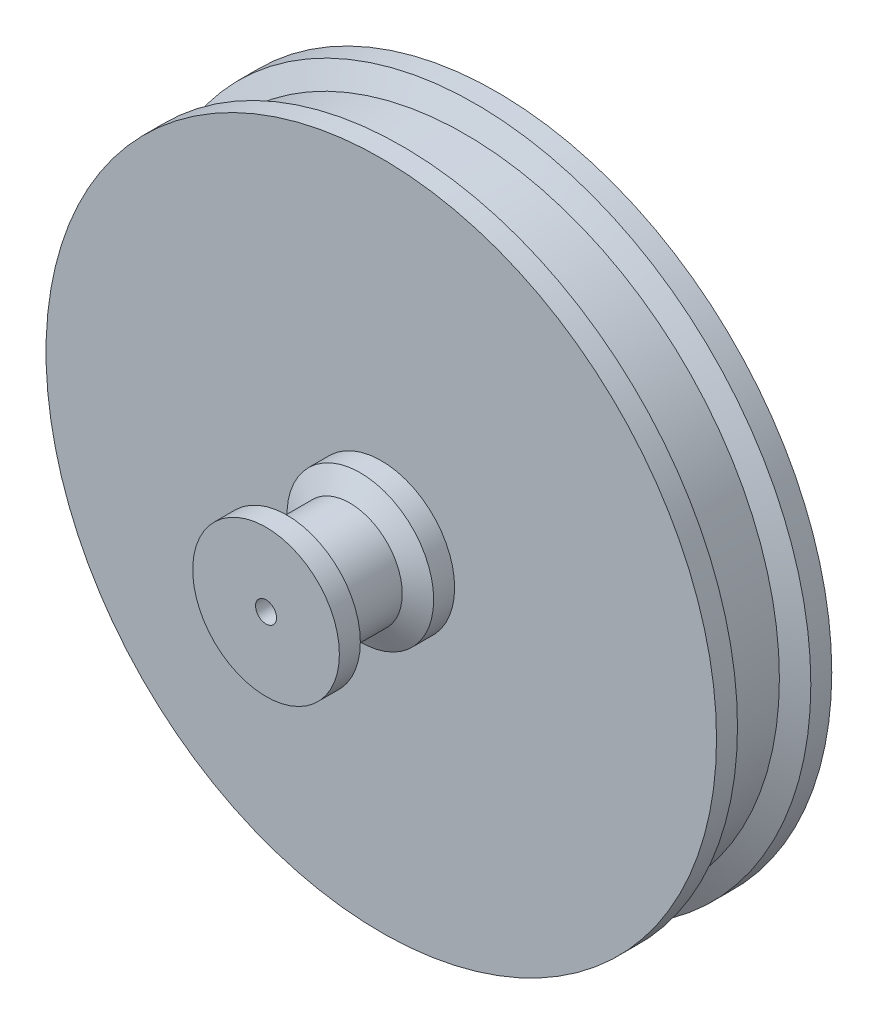
ISO-10303-21;
HEADER;
FILE_DESCRIPTION(('STEP AP214'),'2;1');
FILE_NAME('part.step','',(''),(''),'','','');
FILE_SCHEMA(('AUTOMOTIVE_DESIGN { 1 0 10303 214 1 1 1 1 }'));
ENDSEC;
DATA;
#1=APPLICATION_CONTEXT('core data for automotive mechanical design processes');
#2=APPLICATION_PROTOCOL_DEFINITION('international standard','automotive_design',2000,#1);
#3=PRODUCT_CONTEXT('',#1,'mechanical');
#4=PRODUCT('Part','Part','',(#3));
#5=PRODUCT_RELATED_PRODUCT_CATEGORY('part','',(#4));
#6=PRODUCT_DEFINITION_FORMATION('','',#4);
#7=PRODUCT_DEFINITION_CONTEXT('part definition',#1,'design');
#8=PRODUCT_DEFINITION('design','',#6,#7);
#9=PRODUCT_DEFINITION_SHAPE('','',#8);
#10=(LENGTH_UNIT() NAMED_UNIT(*) SI_UNIT(.MILLI.,.METRE.));
#11=(NAMED_UNIT(*) PLANE_ANGLE_UNIT() SI_UNIT($,.RADIAN.));
#12=(NAMED_UNIT(*) SI_UNIT($,.STERADIAN.) SOLID_ANGLE_UNIT());
#13=UNCERTAINTY_MEASURE_WITH_UNIT(LENGTH_MEASURE(1.E-05),#10,'distance_accuracy_value','');
#14=(GEOMETRIC_REPRESENTATION_CONTEXT(3) GLOBAL_UNCERTAINTY_ASSIGNED_CONTEXT((#13)) GLOBAL_UNIT_ASSIGNED_CONTEXT((#10,
#11,#12)) REPRESENTATION_CONTEXT('',''));
#15=CARTESIAN_POINT('',(0.,0.,0.));
#16=DIRECTION('',(0.,0.,1.));
#17=DIRECTION('',(1.,0.,0.));
#18=AXIS2_PLACEMENT_3D('',#15,#16,#17);
#19=CARTESIAN_POINT('',(0.,0.,22.));
#20=DIRECTION('',(0.,0.,-1.));
#21=DIRECTION('',(-1.,0.,0.));
#22=AXIS2_PLACEMENT_3D('',#19,#20,#21);
#23=CYLINDRICAL_SURFACE('',#22,7.);
#24=CARTESIAN_POINT('',(0.,0.,20.));
#25=DIRECTION('',(0.,0.,1.));
#26=DIRECTION('',(1.,0.,0.));
#27=AXIS2_PLACEMENT_3D('',#24,#25,#26);
#28=CIRCLE('',#27,7.);
#29=CARTESIAN_POINT('',(7.,0.,20.));
#30=VERTEX_POINT('',#29);
#31=EDGE_CURVE('E78',#30,#30,#28,.T.);
#32=ORIENTED_EDGE('',*,*,#31,.T.);
#33=EDGE_LOOP('',(#32));
#34=FACE_BOUND('',#33,.T.);
#35=CARTESIAN_POINT('',(0.,0.,22.));
#36=DIRECTION('',(0.,0.,1.));
#37=DIRECTION('',(1.,0.,0.));
#38=AXIS2_PLACEMENT_3D('',#35,#36,#37);
#39=CIRCLE('',#38,7.);
#40=CARTESIAN_POINT('',(7.,0.,22.));
#41=VERTEX_POINT('',#40);
#42=EDGE_CURVE('E66',#41,#41,#39,.T.);
#43=ORIENTED_EDGE('',*,*,#42,.F.);
#44=EDGE_LOOP('',(#43));
#45=FACE_BOUND('',#44,.T.);
#46=ADVANCED_FACE('F39',(#34,#45),#23,.T.);
#47=CARTESIAN_POINT('',(0.,0.,11.));
#48=DIRECTION('',(0.,0.,1.));
#49=DIRECTION('',(1.,0.,0.));
#50=AXIS2_PLACEMENT_3D('',#47,#48,#49);
#51=PLANE('',#50);
#52=CARTESIAN_POINT('',(0.,0.,11.));
#53=DIRECTION('',(0.,0.,1.));
#54=DIRECTION('',(1.,0.,0.));
#55=AXIS2_PLACEMENT_3D('',#52,#53,#54);
#56=CIRCLE('',#55,32.);
#57=CARTESIAN_POINT('',(32.,0.,11.));
#58=VERTEX_POINT('',#57);
#59=EDGE_CURVE('E10',#58,#58,#56,.T.);
#60=ORIENTED_EDGE('',*,*,#59,.T.);
#61=EDGE_LOOP('',(#60));
#62=FACE_BOUND('',#61,.T.);
#63=CARTESIAN_POINT('',(0.,0.,11.));
#64=DIRECTION('',(0.,0.,1.));
#65=DIRECTION('',(1.,0.,0.));
#66=AXIS2_PLACEMENT_3D('',#63,#64,#65);
#67=CIRCLE('',#66,7.);
#68=CARTESIAN_POINT('',(7.,0.,11.));
#69=VERTEX_POINT('',#68);
#70=EDGE_CURVE('E67',#69,#69,#67,.T.);
#71=ORIENTED_EDGE('',*,*,#70,.F.);
#72=EDGE_LOOP('',(#71));
#73=FACE_BOUND('',#72,.T.);
#74=ADVANCED_FACE('F104',(#62,#73),#51,.T.);
#75=CARTESIAN_POINT('',(0.,0.,11.));
#76=DIRECTION('',(0.,0.,-1.));
#77=DIRECTION('',(-1.,0.,0.));
#78=AXIS2_PLACEMENT_3D('',#75,#76,#77);
#79=CYLINDRICAL_SURFACE('',#78,32.);
#80=CARTESIAN_POINT('',(0.,0.,0.));
#81=DIRECTION('',(0.,0.,1.));
#82=DIRECTION('',(1.,0.,0.));
#83=AXIS2_PLACEMENT_3D('',#80,#81,#82);
#84=CIRCLE('',#83,32.);
#85=CARTESIAN_POINT('',(32.,0.,0.));
#86=VERTEX_POINT('',#85);
#87=EDGE_CURVE('E43',#86,#86,#84,.T.);
#88=ORIENTED_EDGE('',*,*,#87,.T.);
#89=EDGE_LOOP('',(#88));
#90=FACE_BOUND('',#89,.T.);
#91=CARTESIAN_POINT('',(0.,0.,2.));
#92=DIRECTION('',(0.,0.,1.));
#93=DIRECTION('',(1.,0.,0.));
#94=AXIS2_PLACEMENT_3D('',#91,#92,#93);
#95=CIRCLE('',#94,32.);
#96=CARTESIAN_POINT('',(32.,0.,2.));
#97=VERTEX_POINT('',#96);
#98=EDGE_CURVE('E54',#97,#97,#95,.T.);
#99=ORIENTED_EDGE('',*,*,#98,.F.);
#100=EDGE_LOOP('',(#99));
#101=FACE_BOUND('',#100,.T.);
#102=ADVANCED_FACE('F41',(#90,#101),#79,.T.);
#103=ORIENTED_EDGE('',*,*,#59,.F.);
#104=EDGE_LOOP('',(#103));
#105=FACE_BOUND('',#104,.T.);
#106=CARTESIAN_POINT('',(0.,0.,9.00000000000001));
#107=DIRECTION('',(0.,0.,1.));
#108=DIRECTION('',(1.,0.,0.));
#109=AXIS2_PLACEMENT_3D('',#106,#107,#108);
#110=CIRCLE('',#109,32.);
#111=CARTESIAN_POINT('',(32.,0.,9.00000000000001));
#112=VERTEX_POINT('',#111);
#113=EDGE_CURVE('E63',#112,#112,#110,.T.);
#114=ORIENTED_EDGE('',*,*,#113,.T.);
#115=EDGE_LOOP('',(#114));
#116=FACE_BOUND('',#115,.T.);
#117=ADVANCED_FACE('F111',(#105,#116),#79,.T.);
#118=CARTESIAN_POINT('',(0.,0.,0.));
#119=DIRECTION('',(0.,0.,1.));
#120=DIRECTION('',(1.,0.,0.));
#121=AXIS2_PLACEMENT_3D('',#118,#119,#120);
#122=PLANE('',#121);
#123=ORIENTED_EDGE('',*,*,#87,.F.);
#124=EDGE_LOOP('',(#123));
#125=FACE_BOUND('',#124,.T.);
#126=CARTESIAN_POINT('',(0.,0.,0.));
#127=DIRECTION('',(0.,0.,1.));
#128=DIRECTION('',(1.,0.,0.));
#129=AXIS2_PLACEMENT_3D('',#126,#127,#128);
#130=CIRCLE('',#129,1.);
#131=CARTESIAN_POINT('',(1.,0.,0.));
#132=VERTEX_POINT('',#131);
#133=EDGE_CURVE('E50',#132,#132,#130,.T.);
#134=ORIENTED_EDGE('',*,*,#133,.T.);
#135=EDGE_LOOP('',(#134));
#136=FACE_BOUND('',#135,.T.);
#137=ADVANCED_FACE('F117',(#125,#136),#122,.F.);
#138=CARTESIAN_POINT('',(0.,0.,11.));
#139=DIRECTION('',(0.,0.,-1.));
#140=DIRECTION('',(-1.,0.,0.));
#141=AXIS2_PLACEMENT_3D('',#138,#139,#140);
#142=CYLINDRICAL_SURFACE('',#141,1.);
#143=ORIENTED_EDGE('',*,*,#133,.F.);
#144=EDGE_LOOP('',(#143));
#145=FACE_BOUND('',#144,.T.);
#146=CARTESIAN_POINT('',(0.,0.,22.));
#147=DIRECTION('',(0.,0.,1.));
#148=DIRECTION('',(1.,0.,0.));
#149=AXIS2_PLACEMENT_3D('',#146,#147,#148);
#150=CIRCLE('',#149,0.999999999999999);
#151=CARTESIAN_POINT('',(0.999999999999999,0.,22.));
#152=VERTEX_POINT('',#151);
#153=EDGE_CURVE('E70',#152,#152,#150,.T.);
#154=ORIENTED_EDGE('',*,*,#153,.T.);
#155=EDGE_LOOP('',(#154));
#156=FACE_BOUND('',#155,.T.);
#157=ADVANCED_FACE('F115',(#145,#156),#142,.F.);
#158=CARTESIAN_POINT('',(0.,0.,3.));
#159=DIRECTION('',(0.,0.,-1.));
#160=DIRECTION('',(-1.,0.,0.));
#161=AXIS2_PLACEMENT_3D('',#158,#159,#160);
#162=CONICAL_SURFACE('',#161,30.,1.10714871779409);
#163=ORIENTED_EDGE('',*,*,#98,.T.);
#164=EDGE_LOOP('',(#163));
#165=FACE_BOUND('',#164,.T.);
#166=CARTESIAN_POINT('',(0.,0.,3.));
#167=DIRECTION('',(0.,0.,1.));
#168=DIRECTION('',(1.,0.,0.));
#169=AXIS2_PLACEMENT_3D('',#166,#167,#168);
#170=CIRCLE('',#169,30.);
#171=CARTESIAN_POINT('',(30.,0.,3.));
#172=VERTEX_POINT('',#171);
#173=EDGE_CURVE('E57',#172,#172,#170,.T.);
#174=ORIENTED_EDGE('',*,*,#173,.F.);
#175=EDGE_LOOP('',(#174));
#176=FACE_BOUND('',#175,.T.);
#177=ADVANCED_FACE('F124',(#165,#176),#162,.T.);
#178=CARTESIAN_POINT('',(0.,0.,1000.));
#179=DIRECTION('',(0.,0.,1.));
#180=DIRECTION('',(1.,0.,0.));
#181=AXIS2_PLACEMENT_3D('',#178,#179,#180);
#182=CYLINDRICAL_SURFACE('',#181,30.);
#183=ORIENTED_EDGE('',*,*,#173,.T.);
#184=EDGE_LOOP('',(#183));
#185=FACE_BOUND('',#184,.T.);
#186=CARTESIAN_POINT('',(0.,0.,8.00000000000001));
#187=DIRECTION('',(0.,0.,1.));
#188=DIRECTION('',(1.,0.,0.));
#189=AXIS2_PLACEMENT_3D('',#186,#187,#188);
#190=CIRCLE('',#189,30.);
#191=CARTESIAN_POINT('',(30.,0.,8.00000000000001));
#192=VERTEX_POINT('',#191);
#193=EDGE_CURVE('E60',#192,#192,#190,.T.);
#194=ORIENTED_EDGE('',*,*,#193,.F.);
#195=EDGE_LOOP('',(#194));
#196=FACE_BOUND('',#195,.T.);
#197=ADVANCED_FACE('F140',(#185,#196),#182,.T.);
#198=CARTESIAN_POINT('',(0.,0.,9.00000000000001));
#199=DIRECTION('',(0.,0.,1.));
#200=DIRECTION('',(1.,0.,0.));
#201=AXIS2_PLACEMENT_3D('',#198,#199,#200);
#202=CONICAL_SURFACE('',#201,32.,1.10714871779409);
#203=ORIENTED_EDGE('',*,*,#193,.T.);
#204=EDGE_LOOP('',(#203));
#205=FACE_BOUND('',#204,.T.);
#206=ORIENTED_EDGE('',*,*,#113,.F.);
#207=EDGE_LOOP('',(#206));
#208=FACE_BOUND('',#207,.T.);
#209=ADVANCED_FACE('F134',(#205,#208),#202,.T.);
#210=CARTESIAN_POINT('',(0.,0.,22.));
#211=DIRECTION('',(0.,0.,1.));
#212=DIRECTION('',(1.,0.,0.));
#213=AXIS2_PLACEMENT_3D('',#210,#211,#212);
#214=PLANE('',#213);
#215=ORIENTED_EDGE('',*,*,#42,.T.);
#216=EDGE_LOOP('',(#215));
#217=FACE_BOUND('',#216,.T.);
#218=ORIENTED_EDGE('',*,*,#153,.F.);
#219=EDGE_LOOP('',(#218));
#220=FACE_BOUND('',#219,.T.);
#221=ADVANCED_FACE('F100',(#217,#220),#214,.T.);
#222=CARTESIAN_POINT('',(0.,0.,13.));
#223=DIRECTION('',(0.,0.,1.));
#224=DIRECTION('',(1.,0.,0.));
#225=AXIS2_PLACEMENT_3D('',#222,#223,#224);
#226=CIRCLE('',#225,7.);
#227=CARTESIAN_POINT('',(7.,0.,13.));
#228=VERTEX_POINT('',#227);
#229=EDGE_CURVE('E81',#228,#228,#226,.T.);
#230=ORIENTED_EDGE('',*,*,#229,.F.);
#231=EDGE_LOOP('',(#230));
#232=FACE_BOUND('',#231,.T.);
#233=ORIENTED_EDGE('',*,*,#70,.T.);
#234=EDGE_LOOP('',(#233));
#235=FACE_BOUND('',#234,.T.);
#236=ADVANCED_FACE('F97',(#232,#235),#23,.T.);
#237=CARTESIAN_POINT('',(0.,0.,1000.));
#238=DIRECTION('',(0.,0.,1.));
#239=DIRECTION('',(1.,0.,0.));
#240=AXIS2_PLACEMENT_3D('',#237,#238,#239);
#241=CYLINDRICAL_SURFACE('',#240,4.99999999999989);
#242=CARTESIAN_POINT('',(0.,0.,19.));
#243=DIRECTION('',(0.,0.,1.));
#244=DIRECTION('',(1.,0.,0.));
#245=AXIS2_PLACEMENT_3D('',#242,#243,#244);
#246=CIRCLE('',#245,4.99999999999989);
#247=CARTESIAN_POINT('',(4.99999999999989,0.,19.));
#248=VERTEX_POINT('',#247);
#249=EDGE_CURVE('E75',#248,#248,#246,.T.);
#250=ORIENTED_EDGE('',*,*,#249,.F.);
#251=EDGE_LOOP('',(#250));
#252=FACE_BOUND('',#251,.T.);
#253=CARTESIAN_POINT('',(0.,0.,14.));
#254=DIRECTION('',(0.,0.,1.));
#255=DIRECTION('',(1.,0.,0.));
#256=AXIS2_PLACEMENT_3D('',#253,#254,#255);
#257=CIRCLE('',#256,4.99999999999989);
#258=CARTESIAN_POINT('',(4.99999999999989,0.,14.));
#259=VERTEX_POINT('',#258);
#260=EDGE_CURVE('E84',#259,#259,#257,.T.);
#261=ORIENTED_EDGE('',*,*,#260,.T.);
#262=EDGE_LOOP('',(#261));
#263=FACE_BOUND('',#262,.T.);
#264=ADVANCED_FACE('F88',(#252,#263),#241,.T.);
#265=CARTESIAN_POINT('',(0.,0.,19.));
#266=DIRECTION('',(0.,0.,1.));
#267=DIRECTION('',(1.,0.,0.));
#268=AXIS2_PLACEMENT_3D('',#265,#266,#267);
#269=CONICAL_SURFACE('',#268,4.99999999999989,1.10714871779411);
#270=ORIENTED_EDGE('',*,*,#31,.F.);
#271=EDGE_LOOP('',(#270));
#272=FACE_BOUND('',#271,.T.);
#273=ORIENTED_EDGE('',*,*,#249,.T.);
#274=EDGE_LOOP('',(#273));
#275=FACE_BOUND('',#274,.T.);
#276=ADVANCED_FACE('F93',(#272,#275),#269,.T.);
#277=CARTESIAN_POINT('',(0.,0.,13.));
#278=DIRECTION('',(0.,0.,-1.));
#279=DIRECTION('',(-1.,0.,0.));
#280=AXIS2_PLACEMENT_3D('',#277,#278,#279);
#281=CONICAL_SURFACE('',#280,7.,1.10714871779411);
#282=ORIENTED_EDGE('',*,*,#260,.F.);
#283=EDGE_LOOP('',(#282));
#284=FACE_BOUND('',#283,.T.);
#285=ORIENTED_EDGE('',*,*,#229,.T.);
#286=EDGE_LOOP('',(#285));
#287=FACE_BOUND('',#286,.T.);
#288=ADVANCED_FACE('F90',(#284,#287),#281,.T.);
#289=CLOSED_SHELL('',(#46,#74,#102,#117,#137,#157,#177,#197,#209,#221,#236,#264,#276,#288));
#290=MANIFOLD_SOLID_BREP('B2',#289);
#291=ADVANCED_BREP_SHAPE_REPRESENTATION('',(#18,#290),#14);
#292=SHAPE_DEFINITION_REPRESENTATION(#9,#291);
ENDSEC;
END-ISO-10303-21;
